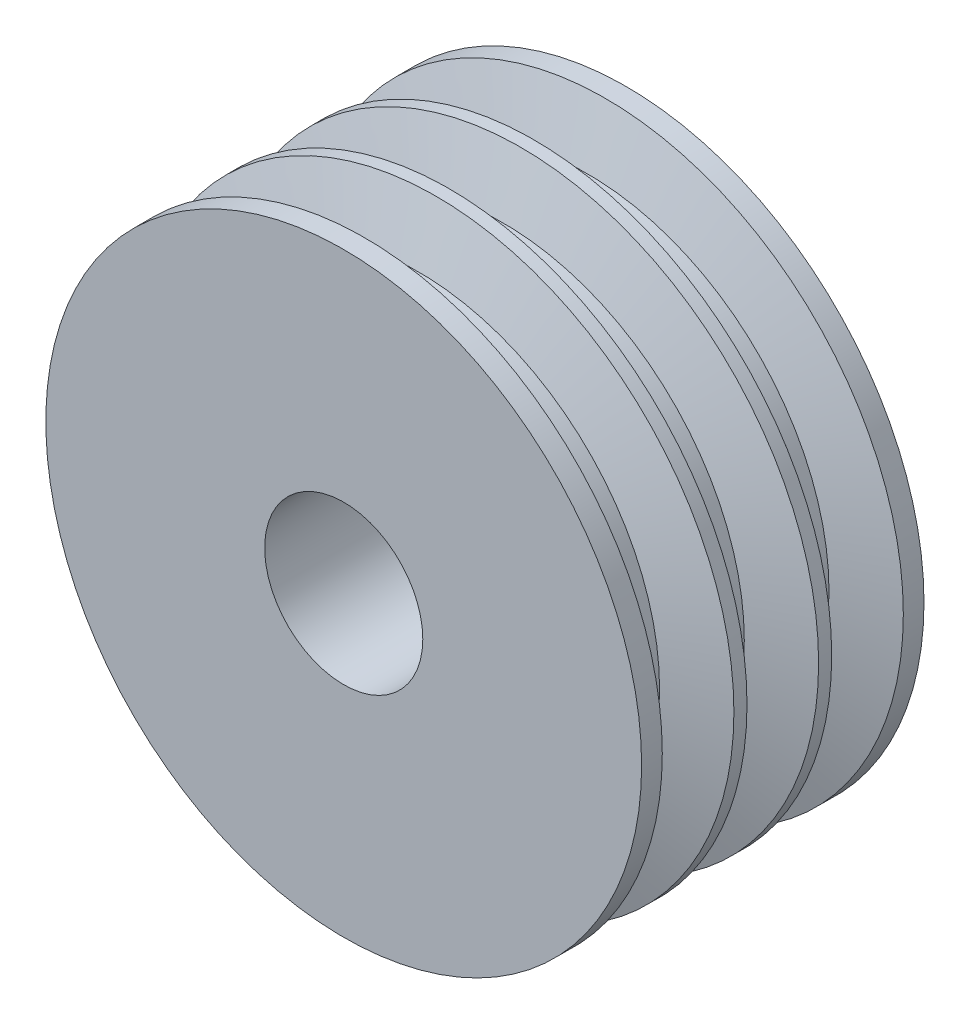
ISO-10303-21;
HEADER;
FILE_DESCRIPTION(('STEP AP214'),'2;1');
FILE_NAME('part.step','',(''),(''),'','','');
FILE_SCHEMA(('AUTOMOTIVE_DESIGN { 1 0 10303 214 1 1 1 1 }'));
ENDSEC;
DATA;
#1=APPLICATION_CONTEXT('core data for automotive mechanical design processes');
#2=APPLICATION_PROTOCOL_DEFINITION('international standard','automotive_design',2000,#1);
#3=PRODUCT_CONTEXT('',#1,'mechanical');
#4=PRODUCT('Part','Part','',(#3));
#5=PRODUCT_RELATED_PRODUCT_CATEGORY('part','',(#4));
#6=PRODUCT_DEFINITION_FORMATION('','',#4);
#7=PRODUCT_DEFINITION_CONTEXT('part definition',#1,'design');
#8=PRODUCT_DEFINITION('design','',#6,#7);
#9=PRODUCT_DEFINITION_SHAPE('','',#8);
#10=(LENGTH_UNIT() NAMED_UNIT(*) SI_UNIT(.MILLI.,.METRE.));
#11=(NAMED_UNIT(*) PLANE_ANGLE_UNIT() SI_UNIT($,.RADIAN.));
#12=(NAMED_UNIT(*) SI_UNIT($,.STERADIAN.) SOLID_ANGLE_UNIT());
#13=UNCERTAINTY_MEASURE_WITH_UNIT(LENGTH_MEASURE(1.E-05),#10,'distance_accuracy_value','');
#14=(GEOMETRIC_REPRESENTATION_CONTEXT(3) GLOBAL_UNCERTAINTY_ASSIGNED_CONTEXT((#13)) GLOBAL_UNIT_ASSIGNED_CONTEXT((#10,
#11,#12)) REPRESENTATION_CONTEXT('',''));
#15=CARTESIAN_POINT('',(0.,0.,0.));
#16=DIRECTION('',(0.,0.,1.));
#17=DIRECTION('',(1.,0.,0.));
#18=AXIS2_PLACEMENT_3D('',#15,#16,#17);
#19=CARTESIAN_POINT('',(0.,14.,-50.));
#20=DIRECTION('',(0.,0.,1.));
#21=DIRECTION('',(1.,0.,0.));
#22=AXIS2_PLACEMENT_3D('',#19,#20,#21);
#23=PLANE('',#22);
#24=CARTESIAN_POINT('',(0.,0.,-50.));
#25=DIRECTION('',(0.,0.,1.));
#26=DIRECTION('',(1.,0.,0.));
#27=AXIS2_PLACEMENT_3D('',#24,#25,#26);
#28=CIRCLE('',#27,52.75);
#29=CARTESIAN_POINT('',(52.75,0.,-50.));
#30=VERTEX_POINT('',#29);
#31=EDGE_CURVE('E110',#30,#30,#28,.T.);
#32=ORIENTED_EDGE('',*,*,#31,.F.);
#33=EDGE_LOOP('',(#32));
#34=FACE_BOUND('',#33,.T.);
#35=CARTESIAN_POINT('',(0.,0.,-50.));
#36=DIRECTION('',(0.,0.,1.));
#37=DIRECTION('',(1.,0.,0.));
#38=AXIS2_PLACEMENT_3D('',#35,#36,#37);
#39=CIRCLE('',#38,14.);
#40=CARTESIAN_POINT('',(14.,0.,-50.));
#41=VERTEX_POINT('',#40);
#42=EDGE_CURVE('E10',#41,#41,#39,.T.);
#43=ORIENTED_EDGE('',*,*,#42,.T.);
#44=EDGE_LOOP('',(#43));
#45=FACE_BOUND('',#44,.T.);
#46=ADVANCED_FACE('F43',(#34,#45),#23,.F.);
#47=CARTESIAN_POINT('',(0.,0.,0.));
#48=DIRECTION('',(0.,0.,1.));
#49=DIRECTION('',(1.,0.,0.));
#50=AXIS2_PLACEMENT_3D('',#47,#48,#49);
#51=CYLINDRICAL_SURFACE('',#50,14.);
#52=ORIENTED_EDGE('',*,*,#42,.F.);
#53=EDGE_LOOP('',(#52));
#54=FACE_BOUND('',#53,.T.);
#55=CARTESIAN_POINT('',(0.,0.,0.));
#56=DIRECTION('',(0.,0.,1.));
#57=DIRECTION('',(1.,0.,0.));
#58=AXIS2_PLACEMENT_3D('',#55,#56,#57);
#59=CIRCLE('',#58,14.);
#60=CARTESIAN_POINT('',(14.,0.,0.));
#61=VERTEX_POINT('',#60);
#62=EDGE_CURVE('E50',#61,#61,#59,.T.);
#63=ORIENTED_EDGE('',*,*,#62,.T.);
#64=EDGE_LOOP('',(#63));
#65=FACE_BOUND('',#64,.T.);
#66=ADVANCED_FACE('F118',(#54,#65),#51,.F.);
#67=CARTESIAN_POINT('',(0.,52.75,0.));
#68=DIRECTION('',(0.,0.,-1.));
#69=DIRECTION('',(-1.,0.,0.));
#70=AXIS2_PLACEMENT_3D('',#67,#68,#69);
#71=PLANE('',#70);
#72=ORIENTED_EDGE('',*,*,#62,.F.);
#73=EDGE_LOOP('',(#72));
#74=FACE_BOUND('',#73,.T.);
#75=CARTESIAN_POINT('',(0.,0.,0.));
#76=DIRECTION('',(0.,0.,1.));
#77=DIRECTION('',(1.,0.,0.));
#78=AXIS2_PLACEMENT_3D('',#75,#76,#77);
#79=CIRCLE('',#78,52.75);
#80=CARTESIAN_POINT('',(52.75,0.,0.));
#81=VERTEX_POINT('',#80);
#82=EDGE_CURVE('E55',#81,#81,#79,.T.);
#83=ORIENTED_EDGE('',*,*,#82,.T.);
#84=EDGE_LOOP('',(#83));
#85=FACE_BOUND('',#84,.T.);
#86=ADVANCED_FACE('F122',(#74,#85),#71,.F.);
#87=CARTESIAN_POINT('',(0.,0.,0.));
#88=DIRECTION('',(0.,0.,1.));
#89=DIRECTION('',(1.,0.,0.));
#90=AXIS2_PLACEMENT_3D('',#87,#88,#89);
#91=CYLINDRICAL_SURFACE('',#90,52.75);
#92=ORIENTED_EDGE('',*,*,#82,.F.);
#93=EDGE_LOOP('',(#92));
#94=FACE_BOUND('',#93,.T.);
#95=CARTESIAN_POINT('',(0.,0.,-3.65924062598872));
#96=DIRECTION('',(0.,0.,1.));
#97=DIRECTION('',(1.,0.,0.));
#98=AXIS2_PLACEMENT_3D('',#95,#96,#97);
#99=CIRCLE('',#98,52.75);
#100=CARTESIAN_POINT('',(52.75,0.,-3.65924062598872));
#101=VERTEX_POINT('',#100);
#102=EDGE_CURVE('E60',#101,#101,#99,.T.);
#103=ORIENTED_EDGE('',*,*,#102,.T.);
#104=EDGE_LOOP('',(#103));
#105=FACE_BOUND('',#104,.T.);
#106=ADVANCED_FACE('F127',(#94,#105),#91,.T.);
#107=CARTESIAN_POINT('',(0.,0.,-6.74070477769873));
#108=DIRECTION('',(0.,0.,1.));
#109=DIRECTION('',(1.,0.,0.));
#110=AXIS2_PLACEMENT_3D('',#107,#108,#109);
#111=CONICAL_SURFACE('',#110,42.6709849106139,1.27409035395587);
#112=ORIENTED_EDGE('',*,*,#102,.F.);
#113=EDGE_LOOP('',(#112));
#114=FACE_BOUND('',#113,.T.);
#115=CARTESIAN_POINT('',(0.,0.,-6.74070477769873));
#116=DIRECTION('',(0.,0.,1.));
#117=DIRECTION('',(1.,0.,0.));
#118=AXIS2_PLACEMENT_3D('',#115,#116,#117);
#119=CIRCLE('',#118,42.6709849106139);
#120=CARTESIAN_POINT('',(42.6709849106139,0.,-6.74070477769873));
#121=VERTEX_POINT('',#120);
#122=EDGE_CURVE('E66',#121,#121,#119,.T.);
#123=ORIENTED_EDGE('',*,*,#122,.T.);
#124=EDGE_LOOP('',(#123));
#125=FACE_BOUND('',#124,.T.);
#126=ADVANCED_FACE('F133',(#114,#125),#111,.T.);
#127=CARTESIAN_POINT('',(0.,0.,0.));
#128=DIRECTION('',(0.,0.,1.));
#129=DIRECTION('',(1.,0.,0.));
#130=AXIS2_PLACEMENT_3D('',#127,#128,#129);
#131=CYLINDRICAL_SURFACE('',#130,42.6709849106139);
#132=ORIENTED_EDGE('',*,*,#122,.F.);
#133=EDGE_LOOP('',(#132));
#134=FACE_BOUND('',#133,.T.);
#135=CARTESIAN_POINT('',(0.,0.,-13.2592952223013));
#136=DIRECTION('',(0.,0.,1.));
#137=DIRECTION('',(1.,0.,0.));
#138=AXIS2_PLACEMENT_3D('',#135,#136,#137);
#139=CIRCLE('',#138,42.6709849106139);
#140=CARTESIAN_POINT('',(42.6709849106139,0.,-13.2592952223013));
#141=VERTEX_POINT('',#140);
#142=EDGE_CURVE('E70',#141,#141,#139,.T.);
#143=ORIENTED_EDGE('',*,*,#142,.T.);
#144=EDGE_LOOP('',(#143));
#145=FACE_BOUND('',#144,.T.);
#146=ADVANCED_FACE('F137',(#134,#145),#131,.T.);
#147=CARTESIAN_POINT('',(0.,0.,-16.3407593740113));
#148=DIRECTION('',(0.,0.,-1.));
#149=DIRECTION('',(-1.,0.,0.));
#150=AXIS2_PLACEMENT_3D('',#147,#148,#149);
#151=CONICAL_SURFACE('',#150,52.75,1.27409035395587);
#152=ORIENTED_EDGE('',*,*,#142,.F.);
#153=EDGE_LOOP('',(#152));
#154=FACE_BOUND('',#153,.T.);
#155=CARTESIAN_POINT('',(0.,0.,-16.3407593740113));
#156=DIRECTION('',(0.,0.,1.));
#157=DIRECTION('',(1.,0.,0.));
#158=AXIS2_PLACEMENT_3D('',#155,#156,#157);
#159=CIRCLE('',#158,52.75);
#160=CARTESIAN_POINT('',(52.75,0.,-16.3407593740113));
#161=VERTEX_POINT('',#160);
#162=EDGE_CURVE('E74',#161,#161,#159,.T.);
#163=ORIENTED_EDGE('',*,*,#162,.T.);
#164=EDGE_LOOP('',(#163));
#165=FACE_BOUND('',#164,.T.);
#166=ADVANCED_FACE('F141',(#154,#165),#151,.T.);
#167=CARTESIAN_POINT('',(0.,0.,0.));
#168=DIRECTION('',(0.,0.,1.));
#169=DIRECTION('',(1.,0.,0.));
#170=AXIS2_PLACEMENT_3D('',#167,#168,#169);
#171=CYLINDRICAL_SURFACE('',#170,52.75);
#172=ORIENTED_EDGE('',*,*,#162,.F.);
#173=EDGE_LOOP('',(#172));
#174=FACE_BOUND('',#173,.T.);
#175=CARTESIAN_POINT('',(0.,0.,-18.6592406259888));
#176=DIRECTION('',(0.,0.,1.));
#177=DIRECTION('',(1.,0.,0.));
#178=AXIS2_PLACEMENT_3D('',#175,#176,#177);
#179=CIRCLE('',#178,52.75);
#180=CARTESIAN_POINT('',(52.75,0.,-18.6592406259888));
#181=VERTEX_POINT('',#180);
#182=EDGE_CURVE('E78',#181,#181,#179,.T.);
#183=ORIENTED_EDGE('',*,*,#182,.T.);
#184=EDGE_LOOP('',(#183));
#185=FACE_BOUND('',#184,.T.);
#186=ADVANCED_FACE('F145',(#174,#185),#171,.T.);
#187=CARTESIAN_POINT('',(0.,0.,-21.7407047776987));
#188=DIRECTION('',(0.,0.,1.));
#189=DIRECTION('',(1.,0.,0.));
#190=AXIS2_PLACEMENT_3D('',#187,#188,#189);
#191=CONICAL_SURFACE('',#190,42.6709849106142,1.27409035395587);
#192=ORIENTED_EDGE('',*,*,#182,.F.);
#193=EDGE_LOOP('',(#192));
#194=FACE_BOUND('',#193,.T.);
#195=CARTESIAN_POINT('',(0.,0.,-21.7407047776987));
#196=DIRECTION('',(0.,0.,1.));
#197=DIRECTION('',(1.,0.,0.));
#198=AXIS2_PLACEMENT_3D('',#195,#196,#197);
#199=CIRCLE('',#198,42.6709849106142);
#200=CARTESIAN_POINT('',(42.6709849106142,0.,-21.7407047776987));
#201=VERTEX_POINT('',#200);
#202=EDGE_CURVE('E82',#201,#201,#199,.T.);
#203=ORIENTED_EDGE('',*,*,#202,.T.);
#204=EDGE_LOOP('',(#203));
#205=FACE_BOUND('',#204,.T.);
#206=ADVANCED_FACE('F149',(#194,#205),#191,.T.);
#207=CARTESIAN_POINT('',(0.,0.,0.));
#208=DIRECTION('',(0.,0.,1.));
#209=DIRECTION('',(1.,0.,0.));
#210=AXIS2_PLACEMENT_3D('',#207,#208,#209);
#211=CYLINDRICAL_SURFACE('',#210,42.6709849106142);
#212=ORIENTED_EDGE('',*,*,#202,.F.);
#213=EDGE_LOOP('',(#212));
#214=FACE_BOUND('',#213,.T.);
#215=CARTESIAN_POINT('',(0.,0.,-28.2592952223013));
#216=DIRECTION('',(0.,0.,1.));
#217=DIRECTION('',(1.,0.,0.));
#218=AXIS2_PLACEMENT_3D('',#215,#216,#217);
#219=CIRCLE('',#218,42.6709849106142);
#220=CARTESIAN_POINT('',(42.6709849106142,0.,-28.2592952223013));
#221=VERTEX_POINT('',#220);
#222=EDGE_CURVE('E86',#221,#221,#219,.T.);
#223=ORIENTED_EDGE('',*,*,#222,.T.);
#224=EDGE_LOOP('',(#223));
#225=FACE_BOUND('',#224,.T.);
#226=ADVANCED_FACE('F153',(#214,#225),#211,.T.);
#227=CARTESIAN_POINT('',(0.,0.,-31.3407593740112));
#228=DIRECTION('',(0.,0.,-1.));
#229=DIRECTION('',(-1.,0.,0.));
#230=AXIS2_PLACEMENT_3D('',#227,#228,#229);
#231=CONICAL_SURFACE('',#230,52.75,1.27409035395587);
#232=ORIENTED_EDGE('',*,*,#222,.F.);
#233=EDGE_LOOP('',(#232));
#234=FACE_BOUND('',#233,.T.);
#235=CARTESIAN_POINT('',(0.,0.,-31.3407593740112));
#236=DIRECTION('',(0.,0.,1.));
#237=DIRECTION('',(1.,0.,0.));
#238=AXIS2_PLACEMENT_3D('',#235,#236,#237);
#239=CIRCLE('',#238,52.75);
#240=CARTESIAN_POINT('',(52.75,0.,-31.3407593740112));
#241=VERTEX_POINT('',#240);
#242=EDGE_CURVE('E90',#241,#241,#239,.T.);
#243=ORIENTED_EDGE('',*,*,#242,.T.);
#244=EDGE_LOOP('',(#243));
#245=FACE_BOUND('',#244,.T.);
#246=ADVANCED_FACE('F157',(#234,#245),#231,.T.);
#247=CARTESIAN_POINT('',(0.,0.,0.));
#248=DIRECTION('',(0.,0.,1.));
#249=DIRECTION('',(1.,0.,0.));
#250=AXIS2_PLACEMENT_3D('',#247,#248,#249);
#251=CYLINDRICAL_SURFACE('',#250,52.75);
#252=ORIENTED_EDGE('',*,*,#242,.F.);
#253=EDGE_LOOP('',(#252));
#254=FACE_BOUND('',#253,.T.);
#255=CARTESIAN_POINT('',(0.,0.,-33.6592406259888));
#256=DIRECTION('',(0.,0.,1.));
#257=DIRECTION('',(1.,0.,0.));
#258=AXIS2_PLACEMENT_3D('',#255,#256,#257);
#259=CIRCLE('',#258,52.75);
#260=CARTESIAN_POINT('',(52.75,0.,-33.6592406259888));
#261=VERTEX_POINT('',#260);
#262=EDGE_CURVE('E94',#261,#261,#259,.T.);
#263=ORIENTED_EDGE('',*,*,#262,.T.);
#264=EDGE_LOOP('',(#263));
#265=FACE_BOUND('',#264,.T.);
#266=ADVANCED_FACE('F161',(#254,#265),#251,.T.);
#267=CARTESIAN_POINT('',(0.,0.,-36.7407047776987));
#268=DIRECTION('',(0.,0.,1.));
#269=DIRECTION('',(1.,0.,0.));
#270=AXIS2_PLACEMENT_3D('',#267,#268,#269);
#271=CONICAL_SURFACE('',#270,42.6709849106144,1.27409035395587);
#272=ORIENTED_EDGE('',*,*,#262,.F.);
#273=EDGE_LOOP('',(#272));
#274=FACE_BOUND('',#273,.T.);
#275=CARTESIAN_POINT('',(0.,0.,-36.7407047776987));
#276=DIRECTION('',(0.,0.,1.));
#277=DIRECTION('',(1.,0.,0.));
#278=AXIS2_PLACEMENT_3D('',#275,#276,#277);
#279=CIRCLE('',#278,42.6709849106144);
#280=CARTESIAN_POINT('',(42.6709849106144,0.,-36.7407047776987));
#281=VERTEX_POINT('',#280);
#282=EDGE_CURVE('E98',#281,#281,#279,.T.);
#283=ORIENTED_EDGE('',*,*,#282,.T.);
#284=EDGE_LOOP('',(#283));
#285=FACE_BOUND('',#284,.T.);
#286=ADVANCED_FACE('F165',(#274,#285),#271,.T.);
#287=CARTESIAN_POINT('',(0.,0.,0.));
#288=DIRECTION('',(0.,0.,1.));
#289=DIRECTION('',(1.,0.,0.));
#290=AXIS2_PLACEMENT_3D('',#287,#288,#289);
#291=CYLINDRICAL_SURFACE('',#290,42.6709849106144);
#292=ORIENTED_EDGE('',*,*,#282,.F.);
#293=EDGE_LOOP('',(#292));
#294=FACE_BOUND('',#293,.T.);
#295=CARTESIAN_POINT('',(0.,0.,-43.2592952223013));
#296=DIRECTION('',(0.,0.,1.));
#297=DIRECTION('',(1.,0.,0.));
#298=AXIS2_PLACEMENT_3D('',#295,#296,#297);
#299=CIRCLE('',#298,42.6709849106144);
#300=CARTESIAN_POINT('',(42.6709849106144,0.,-43.2592952223013));
#301=VERTEX_POINT('',#300);
#302=EDGE_CURVE('E102',#301,#301,#299,.T.);
#303=ORIENTED_EDGE('',*,*,#302,.T.);
#304=EDGE_LOOP('',(#303));
#305=FACE_BOUND('',#304,.T.);
#306=ADVANCED_FACE('F169',(#294,#305),#291,.T.);
#307=CARTESIAN_POINT('',(0.,0.,-46.3407593740112));
#308=DIRECTION('',(0.,0.,-1.));
#309=DIRECTION('',(-1.,0.,0.));
#310=AXIS2_PLACEMENT_3D('',#307,#308,#309);
#311=CONICAL_SURFACE('',#310,52.75,1.27409035395587);
#312=ORIENTED_EDGE('',*,*,#302,.F.);
#313=EDGE_LOOP('',(#312));
#314=FACE_BOUND('',#313,.T.);
#315=CARTESIAN_POINT('',(0.,0.,-46.3407593740112));
#316=DIRECTION('',(0.,0.,1.));
#317=DIRECTION('',(1.,0.,0.));
#318=AXIS2_PLACEMENT_3D('',#315,#316,#317);
#319=CIRCLE('',#318,52.75);
#320=CARTESIAN_POINT('',(52.75,0.,-46.3407593740112));
#321=VERTEX_POINT('',#320);
#322=EDGE_CURVE('E106',#321,#321,#319,.T.);
#323=ORIENTED_EDGE('',*,*,#322,.T.);
#324=EDGE_LOOP('',(#323));
#325=FACE_BOUND('',#324,.T.);
#326=ADVANCED_FACE('F173',(#314,#325),#311,.T.);
#327=CARTESIAN_POINT('',(0.,0.,0.));
#328=DIRECTION('',(0.,0.,1.));
#329=DIRECTION('',(1.,0.,0.));
#330=AXIS2_PLACEMENT_3D('',#327,#328,#329);
#331=CYLINDRICAL_SURFACE('',#330,52.75);
#332=ORIENTED_EDGE('',*,*,#322,.F.);
#333=EDGE_LOOP('',(#332));
#334=FACE_BOUND('',#333,.T.);
#335=ORIENTED_EDGE('',*,*,#31,.T.);
#336=EDGE_LOOP('',(#335));
#337=FACE_BOUND('',#336,.T.);
#338=ADVANCED_FACE('F115',(#334,#337),#331,.T.);
#339=CLOSED_SHELL('',(#46,#66,#86,#106,#126,#146,#166,#186,#206,#226,#246,#266,#286,#306,#326,#338));
#340=MANIFOLD_SOLID_BREP('B2',#339);
#341=ADVANCED_BREP_SHAPE_REPRESENTATION('',(#18,#340),#14);
#342=SHAPE_DEFINITION_REPRESENTATION(#9,#341);
ENDSEC;
END-ISO-10303-21;
